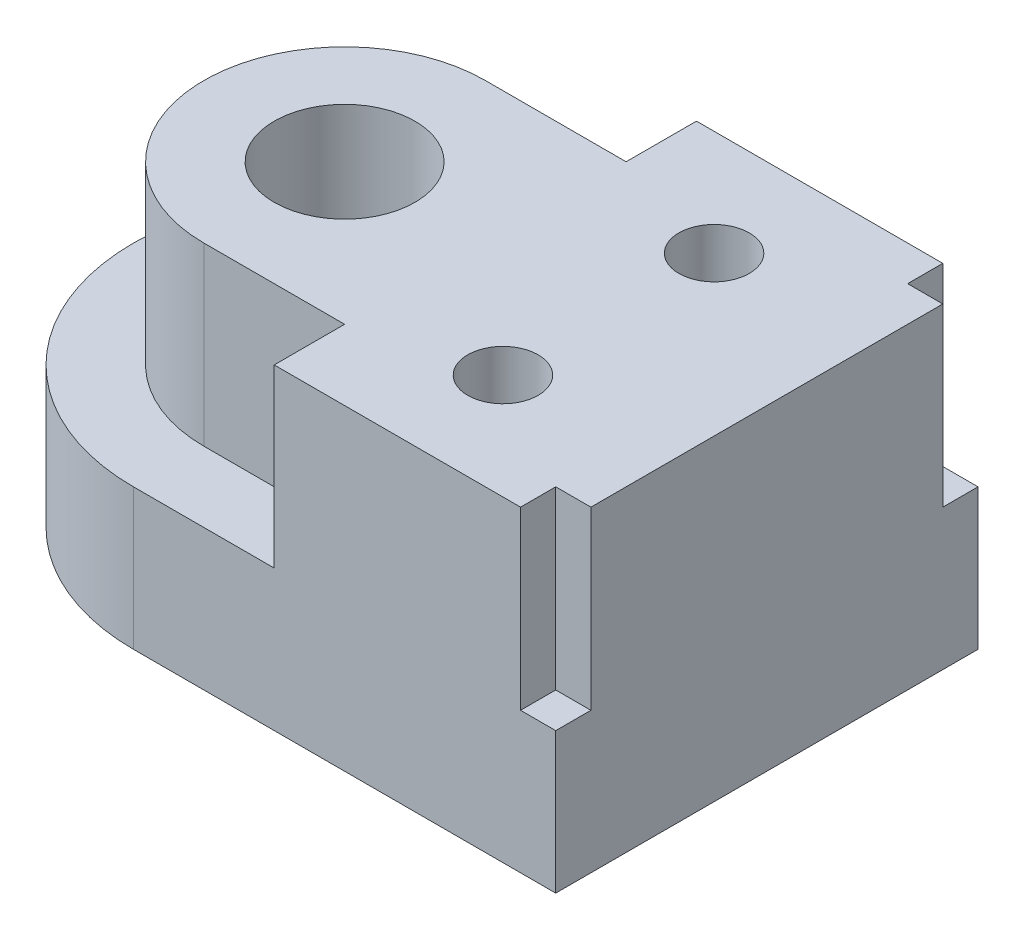
ISO-10303-21;
HEADER;
FILE_DESCRIPTION(('STEP AP214'),'2;1');
FILE_NAME('part.step','',(''),(''),'','','');
FILE_SCHEMA(('AUTOMOTIVE_DESIGN { 1 0 10303 214 1 1 1 1 }'));
ENDSEC;
DATA;
#1=APPLICATION_CONTEXT('core data for automotive mechanical design processes');
#2=APPLICATION_PROTOCOL_DEFINITION('international standard','automotive_design',2000,#1);
#3=PRODUCT_CONTEXT('',#1,'mechanical');
#4=PRODUCT('Part','Part','',(#3));
#5=PRODUCT_RELATED_PRODUCT_CATEGORY('part','',(#4));
#6=PRODUCT_DEFINITION_FORMATION('','',#4);
#7=PRODUCT_DEFINITION_CONTEXT('part definition',#1,'design');
#8=PRODUCT_DEFINITION('design','',#6,#7);
#9=PRODUCT_DEFINITION_SHAPE('','',#8);
#10=(LENGTH_UNIT() NAMED_UNIT(*) SI_UNIT(.MILLI.,.METRE.));
#11=(NAMED_UNIT(*) PLANE_ANGLE_UNIT() SI_UNIT($,.RADIAN.));
#12=(NAMED_UNIT(*) SI_UNIT($,.STERADIAN.) SOLID_ANGLE_UNIT());
#13=UNCERTAINTY_MEASURE_WITH_UNIT(LENGTH_MEASURE(1.E-05),#10,'distance_accuracy_value','');
#14=(GEOMETRIC_REPRESENTATION_CONTEXT(3) GLOBAL_UNCERTAINTY_ASSIGNED_CONTEXT((#13)) GLOBAL_UNIT_ASSIGNED_CONTEXT((#10,
#11,#12)) REPRESENTATION_CONTEXT('',''));
#15=CARTESIAN_POINT('',(0.,0.,0.));
#16=DIRECTION('',(0.,0.,1.));
#17=DIRECTION('',(1.,0.,0.));
#18=AXIS2_PLACEMENT_3D('',#15,#16,#17);
#19=CARTESIAN_POINT('',(0.,45.,-20.));
#20=DIRECTION('',(0.,0.,-1.));
#21=DIRECTION('',(-1.,0.,0.));
#22=AXIS2_PLACEMENT_3D('',#19,#20,#21);
#23=PLANE('',#22);
#24=DIRECTION('',(1.,0.,0.));
#25=VECTOR('',#24,1.);
#26=CARTESIAN_POINT('',(0.,20.,-20.));
#27=LINE('',#26,#25);
#28=CARTESIAN_POINT('',(0.,20.,-20.));
#29=VERTEX_POINT('',#28);
#30=CARTESIAN_POINT('',(20.,20.,-20.));
#31=VERTEX_POINT('',#30);
#32=EDGE_CURVE('E253',#29,#31,#27,.T.);
#33=ORIENTED_EDGE('',*,*,#32,.F.);
#34=DIRECTION('',(0.,-1.,0.));
#35=VECTOR('',#34,1.);
#36=CARTESIAN_POINT('',(0.,45.,-20.));
#37=LINE('',#36,#35);
#38=CARTESIAN_POINT('',(0.,45.,-20.));
#39=VERTEX_POINT('',#38);
#40=EDGE_CURVE('E11',#39,#29,#37,.T.);
#41=ORIENTED_EDGE('',*,*,#40,.F.);
#42=DIRECTION('',(1.,0.,0.));
#43=VECTOR('',#42,1.);
#44=CARTESIAN_POINT('',(0.,45.,-20.));
#45=LINE('',#44,#43);
#46=CARTESIAN_POINT('',(20.,45.,-20.));
#47=VERTEX_POINT('',#46);
#48=EDGE_CURVE('E216',#39,#47,#45,.T.);
#49=ORIENTED_EDGE('',*,*,#48,.T.);
#50=DIRECTION('',(0.,-1.,0.));
#51=VECTOR('',#50,1.);
#52=CARTESIAN_POINT('',(20.,45.,-20.));
#53=LINE('',#52,#51);
#54=EDGE_CURVE('E236',#47,#31,#53,.T.);
#55=ORIENTED_EDGE('',*,*,#54,.T.);
#56=EDGE_LOOP('',(#33,#41,#49,#55));
#57=FACE_BOUND('',#56,.T.);
#58=ADVANCED_FACE('F33',(#57),#23,.T.);
#59=CARTESIAN_POINT('',(0.,45.,0.));
#60=DIRECTION('',(0.,-1.,0.));
#61=DIRECTION('',(0.,0.,-1.));
#62=AXIS2_PLACEMENT_3D('',#59,#60,#61);
#63=CYLINDRICAL_SURFACE('',#62,20.);
#64=ORIENTED_EDGE('',*,*,#40,.T.);
#65=CARTESIAN_POINT('',(0.,20.,0.));
#66=DIRECTION('',(0.,1.,0.));
#67=DIRECTION('',(0.,0.,1.));
#68=AXIS2_PLACEMENT_3D('',#65,#66,#67);
#69=CIRCLE('',#68,20.);
#70=CARTESIAN_POINT('',(0.,20.,20.));
#71=VERTEX_POINT('',#70);
#72=EDGE_CURVE('E199',#29,#71,#69,.T.);
#73=ORIENTED_EDGE('',*,*,#72,.T.);
#74=DIRECTION('',(0.,-1.,0.));
#75=VECTOR('',#74,1.);
#76=CARTESIAN_POINT('',(0.,45.,20.));
#77=LINE('',#76,#75);
#78=CARTESIAN_POINT('',(0.,45.,20.));
#79=VERTEX_POINT('',#78);
#80=EDGE_CURVE('E40',#79,#71,#77,.T.);
#81=ORIENTED_EDGE('',*,*,#80,.F.);
#82=CARTESIAN_POINT('',(0.,45.,0.));
#83=DIRECTION('',(0.,1.,0.));
#84=DIRECTION('',(0.,0.,1.));
#85=AXIS2_PLACEMENT_3D('',#82,#83,#84);
#86=CIRCLE('',#85,20.);
#87=EDGE_CURVE('E219',#39,#79,#86,.T.);
#88=ORIENTED_EDGE('',*,*,#87,.F.);
#89=EDGE_LOOP('',(#64,#73,#81,#88));
#90=FACE_BOUND('',#89,.T.);
#91=ADVANCED_FACE('F299',(#90),#63,.T.);
#92=CARTESIAN_POINT('',(0.,45.,20.));
#93=DIRECTION('',(0.,0.,-1.));
#94=DIRECTION('',(-1.,0.,0.));
#95=AXIS2_PLACEMENT_3D('',#92,#93,#94);
#96=PLANE('',#95);
#97=ORIENTED_EDGE('',*,*,#80,.T.);
#98=DIRECTION('',(1.,0.,0.));
#99=VECTOR('',#98,1.);
#100=CARTESIAN_POINT('',(0.,20.,20.));
#101=LINE('',#100,#99);
#102=CARTESIAN_POINT('',(20.,20.,20.));
#103=VERTEX_POINT('',#102);
#104=EDGE_CURVE('E190',#71,#103,#101,.T.);
#105=ORIENTED_EDGE('',*,*,#104,.T.);
#106=DIRECTION('',(0.,-1.,0.));
#107=VECTOR('',#106,1.);
#108=CARTESIAN_POINT('',(20.,45.,20.));
#109=LINE('',#108,#107);
#110=CARTESIAN_POINT('',(20.,45.,20.));
#111=VERTEX_POINT('',#110);
#112=EDGE_CURVE('E176',#111,#103,#109,.T.);
#113=ORIENTED_EDGE('',*,*,#112,.F.);
#114=DIRECTION('',(1.,0.,0.));
#115=VECTOR('',#114,1.);
#116=CARTESIAN_POINT('',(0.,45.,20.));
#117=LINE('',#116,#115);
#118=EDGE_CURVE('E191',#79,#111,#117,.T.);
#119=ORIENTED_EDGE('',*,*,#118,.F.);
#120=EDGE_LOOP('',(#97,#105,#113,#119));
#121=FACE_BOUND('',#120,.T.);
#122=ADVANCED_FACE('F188',(#121),#96,.F.);
#123=CARTESIAN_POINT('',(20.,45.,0.));
#124=DIRECTION('',(1.,0.,0.));
#125=DIRECTION('',(0.,0.,-1.));
#126=AXIS2_PLACEMENT_3D('',#123,#124,#125);
#127=PLANE('',#126);
#128=ORIENTED_EDGE('',*,*,#112,.T.);
#129=DIRECTION('',(0.,0.,1.));
#130=VECTOR('',#129,1.);
#131=CARTESIAN_POINT('',(20.,20.,0.));
#132=LINE('',#131,#130);
#133=CARTESIAN_POINT('',(20.,20.,30.));
#134=VERTEX_POINT('',#133);
#135=EDGE_CURVE('E201',#103,#134,#132,.T.);
#136=ORIENTED_EDGE('',*,*,#135,.T.);
#137=DIRECTION('',(0.,-1.,0.));
#138=VECTOR('',#137,1.);
#139=CARTESIAN_POINT('',(20.,45.,30.));
#140=LINE('',#139,#138);
#141=CARTESIAN_POINT('',(20.,45.,30.));
#142=VERTEX_POINT('',#141);
#143=EDGE_CURVE('E172',#142,#134,#140,.T.);
#144=ORIENTED_EDGE('',*,*,#143,.F.);
#145=DIRECTION('',(0.,0.,1.));
#146=VECTOR('',#145,1.);
#147=CARTESIAN_POINT('',(20.,45.,0.));
#148=LINE('',#147,#146);
#149=EDGE_CURVE('E223',#111,#142,#148,.T.);
#150=ORIENTED_EDGE('',*,*,#149,.F.);
#151=EDGE_LOOP('',(#128,#136,#144,#150));
#152=FACE_BOUND('',#151,.T.);
#153=ADVANCED_FACE('F332',(#152),#127,.F.);
#154=CARTESIAN_POINT('',(0.,45.,30.));
#155=DIRECTION('',(0.,0.,1.));
#156=DIRECTION('',(1.,0.,0.));
#157=AXIS2_PLACEMENT_3D('',#154,#155,#156);
#158=PLANE('',#157);
#159=DIRECTION('',(0.,1.,0.));
#160=VECTOR('',#159,1.);
#161=CARTESIAN_POINT('',(55.,20.,30.));
#162=LINE('',#161,#160);
#163=CARTESIAN_POINT('',(55.,20.,30.));
#164=VERTEX_POINT('',#163);
#165=CARTESIAN_POINT('',(55.,45.,30.));
#166=VERTEX_POINT('',#165);
#167=EDGE_CURVE('E212',#164,#166,#162,.T.);
#168=ORIENTED_EDGE('',*,*,#167,.T.);
#169=DIRECTION('',(-1.,0.,0.));
#170=VECTOR('',#169,1.);
#171=CARTESIAN_POINT('',(0.,45.,30.));
#172=LINE('',#171,#170);
#173=EDGE_CURVE('E226',#166,#142,#172,.T.);
#174=ORIENTED_EDGE('',*,*,#173,.T.);
#175=ORIENTED_EDGE('',*,*,#143,.T.);
#176=DIRECTION('',(-1.,0.,0.));
#177=VECTOR('',#176,1.);
#178=CARTESIAN_POINT('',(0.,20.,30.));
#179=LINE('',#178,#177);
#180=CARTESIAN_POINT('',(0.,20.,30.));
#181=VERTEX_POINT('',#180);
#182=EDGE_CURVE('E206',#134,#181,#179,.T.);
#183=ORIENTED_EDGE('',*,*,#182,.T.);
#184=DIRECTION('',(0.,-1.,0.));
#185=VECTOR('',#184,1.);
#186=CARTESIAN_POINT('',(0.,20.,30.));
#187=LINE('',#186,#185);
#188=CARTESIAN_POINT('',(0.,0.,30.));
#189=VERTEX_POINT('',#188);
#190=EDGE_CURVE('E202',#181,#189,#187,.T.);
#191=ORIENTED_EDGE('',*,*,#190,.T.);
#192=DIRECTION('',(-1.,0.,0.));
#193=VECTOR('',#192,1.);
#194=CARTESIAN_POINT('',(0.,0.,30.));
#195=LINE('',#194,#193);
#196=CARTESIAN_POINT('',(60.,0.,30.));
#197=VERTEX_POINT('',#196);
#198=EDGE_CURVE('E170',#197,#189,#195,.T.);
#199=ORIENTED_EDGE('',*,*,#198,.F.);
#200=DIRECTION('',(0.,-1.,0.));
#201=VECTOR('',#200,1.);
#202=CARTESIAN_POINT('',(60.,45.,30.));
#203=LINE('',#202,#201);
#204=CARTESIAN_POINT('',(60.,20.,30.));
#205=VERTEX_POINT('',#204);
#206=EDGE_CURVE('E163',#205,#197,#203,.T.);
#207=ORIENTED_EDGE('',*,*,#206,.F.);
#208=DIRECTION('',(1.,0.,0.));
#209=VECTOR('',#208,1.);
#210=CARTESIAN_POINT('',(55.,20.,30.));
#211=LINE('',#210,#209);
#212=EDGE_CURVE('E148',#164,#205,#211,.T.);
#213=ORIENTED_EDGE('',*,*,#212,.F.);
#214=EDGE_LOOP('',(#168,#174,#175,#183,#191,#199,#207,#213));
#215=FACE_BOUND('',#214,.T.);
#216=ADVANCED_FACE('F168',(#215),#158,.T.);
#217=CARTESIAN_POINT('',(60.,45.,0.));
#218=DIRECTION('',(1.,0.,0.));
#219=DIRECTION('',(0.,0.,-1.));
#220=AXIS2_PLACEMENT_3D('',#217,#218,#219);
#221=PLANE('',#220);
#222=DIRECTION('',(0.,1.,0.));
#223=VECTOR('',#222,1.);
#224=CARTESIAN_POINT('',(60.,20.,25.));
#225=LINE('',#224,#223);
#226=CARTESIAN_POINT('',(60.,20.,25.));
#227=VERTEX_POINT('',#226);
#228=CARTESIAN_POINT('',(60.,45.,25.));
#229=VERTEX_POINT('',#228);
#230=EDGE_CURVE('E55',#227,#229,#225,.T.);
#231=ORIENTED_EDGE('',*,*,#230,.F.);
#232=DIRECTION('',(0.,0.,-1.));
#233=VECTOR('',#232,1.);
#234=CARTESIAN_POINT('',(60.,20.,30.));
#235=LINE('',#234,#233);
#236=EDGE_CURVE('E152',#205,#227,#235,.T.);
#237=ORIENTED_EDGE('',*,*,#236,.F.);
#238=ORIENTED_EDGE('',*,*,#206,.T.);
#239=DIRECTION('',(0.,0.,1.));
#240=VECTOR('',#239,1.);
#241=CARTESIAN_POINT('',(60.,0.,0.));
#242=LINE('',#241,#240);
#243=CARTESIAN_POINT('',(60.,0.,-30.));
#244=VERTEX_POINT('',#243);
#245=EDGE_CURVE('E238',#244,#197,#242,.T.);
#246=ORIENTED_EDGE('',*,*,#245,.F.);
#247=DIRECTION('',(0.,-1.,0.));
#248=VECTOR('',#247,1.);
#249=CARTESIAN_POINT('',(60.,45.,-30.));
#250=LINE('',#249,#248);
#251=CARTESIAN_POINT('',(60.,20.,-30.));
#252=VERTEX_POINT('',#251);
#253=EDGE_CURVE('E173',#252,#244,#250,.T.);
#254=ORIENTED_EDGE('',*,*,#253,.F.);
#255=DIRECTION('',(0.,0.,-1.));
#256=VECTOR('',#255,1.);
#257=CARTESIAN_POINT('',(60.,20.,-25.));
#258=LINE('',#257,#256);
#259=CARTESIAN_POINT('',(60.,20.,-25.));
#260=VERTEX_POINT('',#259);
#261=EDGE_CURVE('E272',#260,#252,#258,.T.);
#262=ORIENTED_EDGE('',*,*,#261,.F.);
#263=DIRECTION('',(0.,1.,0.));
#264=VECTOR('',#263,1.);
#265=CARTESIAN_POINT('',(60.,20.,-25.));
#266=LINE('',#265,#264);
#267=CARTESIAN_POINT('',(60.,45.,-25.));
#268=VERTEX_POINT('',#267);
#269=EDGE_CURVE('E293',#260,#268,#266,.T.);
#270=ORIENTED_EDGE('',*,*,#269,.T.);
#271=DIRECTION('',(0.,0.,1.));
#272=VECTOR('',#271,1.);
#273=CARTESIAN_POINT('',(60.,45.,0.));
#274=LINE('',#273,#272);
#275=EDGE_CURVE('E228',#268,#229,#274,.T.);
#276=ORIENTED_EDGE('',*,*,#275,.T.);
#277=EDGE_LOOP('',(#231,#237,#238,#246,#254,#262,#270,#276));
#278=FACE_BOUND('',#277,.T.);
#279=ADVANCED_FACE('F161',(#278),#221,.T.);
#280=CARTESIAN_POINT('',(0.,45.,-30.));
#281=DIRECTION('',(0.,0.,-1.));
#282=DIRECTION('',(-1.,0.,0.));
#283=AXIS2_PLACEMENT_3D('',#280,#281,#282);
#284=PLANE('',#283);
#285=DIRECTION('',(0.,1.,0.));
#286=VECTOR('',#285,1.);
#287=CARTESIAN_POINT('',(55.,20.,-30.));
#288=LINE('',#287,#286);
#289=CARTESIAN_POINT('',(55.,20.,-30.));
#290=VERTEX_POINT('',#289);
#291=CARTESIAN_POINT('',(55.,45.,-30.));
#292=VERTEX_POINT('',#291);
#293=EDGE_CURVE('E47',#290,#292,#288,.T.);
#294=ORIENTED_EDGE('',*,*,#293,.F.);
#295=DIRECTION('',(-1.,0.,0.));
#296=VECTOR('',#295,1.);
#297=CARTESIAN_POINT('',(60.,20.,-30.));
#298=LINE('',#297,#296);
#299=EDGE_CURVE('E275',#252,#290,#298,.T.);
#300=ORIENTED_EDGE('',*,*,#299,.F.);
#301=ORIENTED_EDGE('',*,*,#253,.T.);
#302=DIRECTION('',(1.,0.,0.));
#303=VECTOR('',#302,1.);
#304=CARTESIAN_POINT('',(0.,0.,-30.));
#305=LINE('',#304,#303);
#306=CARTESIAN_POINT('',(0.,0.,-30.));
#307=VERTEX_POINT('',#306);
#308=EDGE_CURVE('E220',#307,#244,#305,.T.);
#309=ORIENTED_EDGE('',*,*,#308,.F.);
#310=DIRECTION('',(0.,-1.,0.));
#311=VECTOR('',#310,1.);
#312=CARTESIAN_POINT('',(0.,20.,-30.));
#313=LINE('',#312,#311);
#314=CARTESIAN_POINT('',(0.,20.,-30.));
#315=VERTEX_POINT('',#314);
#316=EDGE_CURVE('E204',#315,#307,#313,.T.);
#317=ORIENTED_EDGE('',*,*,#316,.F.);
#318=DIRECTION('',(1.,0.,0.));
#319=VECTOR('',#318,1.);
#320=CARTESIAN_POINT('',(0.,20.,-30.));
#321=LINE('',#320,#319);
#322=CARTESIAN_POINT('',(20.,20.,-30.));
#323=VERTEX_POINT('',#322);
#324=EDGE_CURVE('E252',#315,#323,#321,.T.);
#325=ORIENTED_EDGE('',*,*,#324,.T.);
#326=DIRECTION('',(0.,-1.,0.));
#327=VECTOR('',#326,1.);
#328=CARTESIAN_POINT('',(20.,45.,-30.));
#329=LINE('',#328,#327);
#330=CARTESIAN_POINT('',(20.,45.,-30.));
#331=VERTEX_POINT('',#330);
#332=EDGE_CURVE('E178',#331,#323,#329,.T.);
#333=ORIENTED_EDGE('',*,*,#332,.F.);
#334=DIRECTION('',(1.,0.,0.));
#335=VECTOR('',#334,1.);
#336=CARTESIAN_POINT('',(0.,45.,-30.));
#337=LINE('',#336,#335);
#338=EDGE_CURVE('E230',#331,#292,#337,.T.);
#339=ORIENTED_EDGE('',*,*,#338,.T.);
#340=EDGE_LOOP('',(#294,#300,#301,#309,#317,#325,#333,#339));
#341=FACE_BOUND('',#340,.T.);
#342=ADVANCED_FACE('F255',(#341),#284,.T.);
#343=CARTESIAN_POINT('',(20.,45.,0.));
#344=DIRECTION('',(-1.,0.,0.));
#345=DIRECTION('',(0.,0.,1.));
#346=AXIS2_PLACEMENT_3D('',#343,#344,#345);
#347=PLANE('',#346);
#348=DIRECTION('',(0.,0.,-1.));
#349=VECTOR('',#348,1.);
#350=CARTESIAN_POINT('',(20.,20.,0.));
#351=LINE('',#350,#349);
#352=EDGE_CURVE('E246',#31,#323,#351,.T.);
#353=ORIENTED_EDGE('',*,*,#352,.F.);
#354=ORIENTED_EDGE('',*,*,#54,.F.);
#355=DIRECTION('',(0.,0.,-1.));
#356=VECTOR('',#355,1.);
#357=CARTESIAN_POINT('',(20.,45.,0.));
#358=LINE('',#357,#356);
#359=EDGE_CURVE('E233',#47,#331,#358,.T.);
#360=ORIENTED_EDGE('',*,*,#359,.T.);
#361=ORIENTED_EDGE('',*,*,#332,.T.);
#362=EDGE_LOOP('',(#353,#354,#360,#361));
#363=FACE_BOUND('',#362,.T.);
#364=ADVANCED_FACE('F245',(#363),#347,.T.);
#365=CARTESIAN_POINT('',(0.,45.,0.));
#366=DIRECTION('',(0.,1.,0.));
#367=DIRECTION('',(0.,0.,1.));
#368=AXIS2_PLACEMENT_3D('',#365,#366,#367);
#369=PLANE('',#368);
#370=CARTESIAN_POINT('',(0.,45.,0.));
#371=DIRECTION('',(0.,1.,0.));
#372=DIRECTION('',(0.,0.,1.));
#373=AXIS2_PLACEMENT_3D('',#370,#371,#372);
#374=CIRCLE('',#373,10.);
#375=CARTESIAN_POINT('',(0.,45.,10.));
#376=VERTEX_POINT('',#375);
#377=EDGE_CURVE('E446',#376,#376,#374,.T.);
#378=ORIENTED_EDGE('',*,*,#377,.F.);
#379=EDGE_LOOP('',(#378));
#380=FACE_BOUND('',#379,.T.);
#381=CARTESIAN_POINT('',(37.5,45.,-15.));
#382=DIRECTION('',(0.,1.,0.));
#383=DIRECTION('',(0.,0.,1.));
#384=AXIS2_PLACEMENT_3D('',#381,#382,#383);
#385=CIRCLE('',#384,5.);
#386=CARTESIAN_POINT('',(37.5,45.,-10.));
#387=VERTEX_POINT('',#386);
#388=EDGE_CURVE('E451',#387,#387,#385,.T.);
#389=ORIENTED_EDGE('',*,*,#388,.F.);
#390=EDGE_LOOP('',(#389));
#391=FACE_BOUND('',#390,.T.);
#392=CARTESIAN_POINT('',(37.5,45.,15.));
#393=DIRECTION('',(0.,1.,0.));
#394=DIRECTION('',(0.,0.,1.));
#395=AXIS2_PLACEMENT_3D('',#392,#393,#394);
#396=CIRCLE('',#395,5.);
#397=CARTESIAN_POINT('',(37.5,45.,20.));
#398=VERTEX_POINT('',#397);
#399=EDGE_CURVE('E459',#398,#398,#396,.T.);
#400=ORIENTED_EDGE('',*,*,#399,.F.);
#401=EDGE_LOOP('',(#400));
#402=FACE_BOUND('',#401,.T.);
#403=DIRECTION('',(0.,0.,1.));
#404=VECTOR('',#403,1.);
#405=CARTESIAN_POINT('',(55.,45.,30.));
#406=LINE('',#405,#404);
#407=CARTESIAN_POINT('',(55.,45.,25.));
#408=VERTEX_POINT('',#407);
#409=EDGE_CURVE('E158',#408,#166,#406,.T.);
#410=ORIENTED_EDGE('',*,*,#409,.F.);
#411=DIRECTION('',(-1.,0.,0.));
#412=VECTOR('',#411,1.);
#413=CARTESIAN_POINT('',(55.,45.,25.));
#414=LINE('',#413,#412);
#415=EDGE_CURVE('E295',#229,#408,#414,.T.);
#416=ORIENTED_EDGE('',*,*,#415,.F.);
#417=ORIENTED_EDGE('',*,*,#275,.F.);
#418=DIRECTION('',(1.,0.,0.));
#419=VECTOR('',#418,1.);
#420=CARTESIAN_POINT('',(55.,45.,-25.));
#421=LINE('',#420,#419);
#422=CARTESIAN_POINT('',(55.,45.,-25.));
#423=VERTEX_POINT('',#422);
#424=EDGE_CURVE('E279',#423,#268,#421,.T.);
#425=ORIENTED_EDGE('',*,*,#424,.F.);
#426=DIRECTION('',(0.,0.,1.));
#427=VECTOR('',#426,1.);
#428=CARTESIAN_POINT('',(55.,45.,-30.));
#429=LINE('',#428,#427);
#430=EDGE_CURVE('E283',#292,#423,#429,.T.);
#431=ORIENTED_EDGE('',*,*,#430,.F.);
#432=ORIENTED_EDGE('',*,*,#338,.F.);
#433=ORIENTED_EDGE('',*,*,#359,.F.);
#434=ORIENTED_EDGE('',*,*,#48,.F.);
#435=ORIENTED_EDGE('',*,*,#87,.T.);
#436=ORIENTED_EDGE('',*,*,#118,.T.);
#437=ORIENTED_EDGE('',*,*,#149,.T.);
#438=ORIENTED_EDGE('',*,*,#173,.F.);
#439=EDGE_LOOP('',(#410,#416,#417,#425,#431,#432,#433,#434,#435,#436,#437,#438));
#440=FACE_BOUND('',#439,.T.);
#441=ADVANCED_FACE('F304',(#380,#391,#402,#440),#369,.T.);
#442=CARTESIAN_POINT('',(0.,0.,0.));
#443=DIRECTION('',(0.,1.,0.));
#444=DIRECTION('',(0.,0.,1.));
#445=AXIS2_PLACEMENT_3D('',#442,#443,#444);
#446=PLANE('',#445);
#447=CARTESIAN_POINT('',(0.,0.,0.));
#448=DIRECTION('',(0.,1.,0.));
#449=DIRECTION('',(0.,0.,1.));
#450=AXIS2_PLACEMENT_3D('',#447,#448,#449);
#451=CIRCLE('',#450,10.);
#452=CARTESIAN_POINT('',(0.,0.,10.));
#453=VERTEX_POINT('',#452);
#454=EDGE_CURVE('E291',#453,#453,#451,.T.);
#455=ORIENTED_EDGE('',*,*,#454,.T.);
#456=EDGE_LOOP('',(#455));
#457=FACE_BOUND('',#456,.T.);
#458=CARTESIAN_POINT('',(37.5,0.,-15.));
#459=DIRECTION('',(0.,1.,0.));
#460=DIRECTION('',(0.,0.,1.));
#461=AXIS2_PLACEMENT_3D('',#458,#459,#460);
#462=CIRCLE('',#461,5.);
#463=CARTESIAN_POINT('',(37.5,0.,-10.));
#464=VERTEX_POINT('',#463);
#465=EDGE_CURVE('E447',#464,#464,#462,.T.);
#466=ORIENTED_EDGE('',*,*,#465,.T.);
#467=EDGE_LOOP('',(#466));
#468=FACE_BOUND('',#467,.T.);
#469=CARTESIAN_POINT('',(37.5,0.,15.));
#470=DIRECTION('',(0.,1.,0.));
#471=DIRECTION('',(0.,0.,1.));
#472=AXIS2_PLACEMENT_3D('',#469,#470,#471);
#473=CIRCLE('',#472,5.);
#474=CARTESIAN_POINT('',(37.5,0.,20.));
#475=VERTEX_POINT('',#474);
#476=EDGE_CURVE('E456',#475,#475,#473,.T.);
#477=ORIENTED_EDGE('',*,*,#476,.T.);
#478=EDGE_LOOP('',(#477));
#479=FACE_BOUND('',#478,.T.);
#480=CARTESIAN_POINT('',(0.,0.,0.));
#481=DIRECTION('',(0.,1.,0.));
#482=DIRECTION('',(0.,0.,1.));
#483=AXIS2_PLACEMENT_3D('',#480,#481,#482);
#484=CIRCLE('',#483,30.);
#485=EDGE_CURVE('E210',#307,#189,#484,.T.);
#486=ORIENTED_EDGE('',*,*,#485,.F.);
#487=ORIENTED_EDGE('',*,*,#308,.T.);
#488=ORIENTED_EDGE('',*,*,#245,.T.);
#489=ORIENTED_EDGE('',*,*,#198,.T.);
#490=EDGE_LOOP('',(#486,#487,#488,#489));
#491=FACE_BOUND('',#490,.T.);
#492=ADVANCED_FACE('F268',(#457,#468,#479,#491),#446,.F.);
#493=CARTESIAN_POINT('',(0.,20.,0.));
#494=DIRECTION('',(0.,-1.,0.));
#495=DIRECTION('',(0.,0.,-1.));
#496=AXIS2_PLACEMENT_3D('',#493,#494,#495);
#497=CYLINDRICAL_SURFACE('',#496,30.);
#498=ORIENTED_EDGE('',*,*,#485,.T.);
#499=ORIENTED_EDGE('',*,*,#190,.F.);
#500=CARTESIAN_POINT('',(0.,20.,0.));
#501=DIRECTION('',(0.,1.,0.));
#502=DIRECTION('',(0.,0.,1.));
#503=AXIS2_PLACEMENT_3D('',#500,#501,#502);
#504=CIRCLE('',#503,30.);
#505=EDGE_CURVE('E257',#315,#181,#504,.T.);
#506=ORIENTED_EDGE('',*,*,#505,.F.);
#507=ORIENTED_EDGE('',*,*,#316,.T.);
#508=EDGE_LOOP('',(#498,#499,#506,#507));
#509=FACE_BOUND('',#508,.T.);
#510=ADVANCED_FACE('F265',(#509),#497,.T.);
#511=CARTESIAN_POINT('',(0.,20.,0.));
#512=DIRECTION('',(0.,1.,0.));
#513=DIRECTION('',(0.,0.,1.));
#514=AXIS2_PLACEMENT_3D('',#511,#512,#513);
#515=PLANE('',#514);
#516=ORIENTED_EDGE('',*,*,#72,.F.);
#517=ORIENTED_EDGE('',*,*,#32,.T.);
#518=ORIENTED_EDGE('',*,*,#352,.T.);
#519=ORIENTED_EDGE('',*,*,#324,.F.);
#520=ORIENTED_EDGE('',*,*,#505,.T.);
#521=ORIENTED_EDGE('',*,*,#182,.F.);
#522=ORIENTED_EDGE('',*,*,#135,.F.);
#523=ORIENTED_EDGE('',*,*,#104,.F.);
#524=EDGE_LOOP('',(#516,#517,#518,#519,#520,#521,#522,#523));
#525=FACE_BOUND('',#524,.T.);
#526=ADVANCED_FACE('F197',(#525),#515,.T.);
#527=CARTESIAN_POINT('',(55.,20.,-25.));
#528=DIRECTION('',(0.,0.,1.));
#529=DIRECTION('',(1.,0.,0.));
#530=AXIS2_PLACEMENT_3D('',#527,#528,#529);
#531=PLANE('',#530);
#532=ORIENTED_EDGE('',*,*,#424,.T.);
#533=ORIENTED_EDGE('',*,*,#269,.F.);
#534=DIRECTION('',(1.,0.,0.));
#535=VECTOR('',#534,1.);
#536=CARTESIAN_POINT('',(55.,20.,-25.));
#537=LINE('',#536,#535);
#538=CARTESIAN_POINT('',(55.,20.,-25.));
#539=VERTEX_POINT('',#538);
#540=EDGE_CURVE('E281',#539,#260,#537,.T.);
#541=ORIENTED_EDGE('',*,*,#540,.F.);
#542=DIRECTION('',(0.,1.,0.));
#543=VECTOR('',#542,1.);
#544=CARTESIAN_POINT('',(55.,20.,-25.));
#545=LINE('',#544,#543);
#546=EDGE_CURVE('E296',#539,#423,#545,.T.);
#547=ORIENTED_EDGE('',*,*,#546,.T.);
#548=EDGE_LOOP('',(#532,#533,#541,#547));
#549=FACE_BOUND('',#548,.T.);
#550=ADVANCED_FACE('F310',(#549),#531,.F.);
#551=CARTESIAN_POINT('',(55.,20.,-30.));
#552=DIRECTION('',(-1.,0.,0.));
#553=DIRECTION('',(0.,0.,1.));
#554=AXIS2_PLACEMENT_3D('',#551,#552,#553);
#555=PLANE('',#554);
#556=ORIENTED_EDGE('',*,*,#430,.T.);
#557=ORIENTED_EDGE('',*,*,#546,.F.);
#558=DIRECTION('',(0.,0.,1.));
#559=VECTOR('',#558,1.);
#560=CARTESIAN_POINT('',(55.,20.,-30.));
#561=LINE('',#560,#559);
#562=EDGE_CURVE('E278',#290,#539,#561,.T.);
#563=ORIENTED_EDGE('',*,*,#562,.F.);
#564=ORIENTED_EDGE('',*,*,#293,.T.);
#565=EDGE_LOOP('',(#556,#557,#563,#564));
#566=FACE_BOUND('',#565,.T.);
#567=ADVANCED_FACE('F307',(#566),#555,.F.);
#568=CARTESIAN_POINT('',(0.,20.,0.));
#569=DIRECTION('',(0.,1.,0.));
#570=DIRECTION('',(0.,0.,1.));
#571=AXIS2_PLACEMENT_3D('',#568,#569,#570);
#572=PLANE('',#571);
#573=ORIENTED_EDGE('',*,*,#299,.T.);
#574=ORIENTED_EDGE('',*,*,#562,.T.);
#575=ORIENTED_EDGE('',*,*,#540,.T.);
#576=ORIENTED_EDGE('',*,*,#261,.T.);
#577=EDGE_LOOP('',(#573,#574,#575,#576));
#578=FACE_BOUND('',#577,.T.);
#579=ADVANCED_FACE('F311',(#578),#572,.T.);
#580=CARTESIAN_POINT('',(55.,20.,30.));
#581=DIRECTION('',(-1.,0.,0.));
#582=DIRECTION('',(0.,0.,1.));
#583=AXIS2_PLACEMENT_3D('',#580,#581,#582);
#584=PLANE('',#583);
#585=ORIENTED_EDGE('',*,*,#409,.T.);
#586=ORIENTED_EDGE('',*,*,#167,.F.);
#587=DIRECTION('',(0.,0.,1.));
#588=VECTOR('',#587,1.);
#589=CARTESIAN_POINT('',(55.,20.,30.));
#590=LINE('',#589,#588);
#591=CARTESIAN_POINT('',(55.,20.,25.));
#592=VERTEX_POINT('',#591);
#593=EDGE_CURVE('E154',#592,#164,#590,.T.);
#594=ORIENTED_EDGE('',*,*,#593,.F.);
#595=DIRECTION('',(0.,1.,0.));
#596=VECTOR('',#595,1.);
#597=CARTESIAN_POINT('',(55.,20.,25.));
#598=LINE('',#597,#596);
#599=EDGE_CURVE('E466',#592,#408,#598,.T.);
#600=ORIENTED_EDGE('',*,*,#599,.T.);
#601=EDGE_LOOP('',(#585,#586,#594,#600));
#602=FACE_BOUND('',#601,.T.);
#603=ADVANCED_FACE('F313',(#602),#584,.F.);
#604=CARTESIAN_POINT('',(55.,20.,25.));
#605=DIRECTION('',(0.,0.,-1.));
#606=DIRECTION('',(-1.,0.,0.));
#607=AXIS2_PLACEMENT_3D('',#604,#605,#606);
#608=PLANE('',#607);
#609=ORIENTED_EDGE('',*,*,#415,.T.);
#610=ORIENTED_EDGE('',*,*,#599,.F.);
#611=DIRECTION('',(-1.,0.,0.));
#612=VECTOR('',#611,1.);
#613=CARTESIAN_POINT('',(55.,20.,25.));
#614=LINE('',#613,#612);
#615=EDGE_CURVE('E166',#227,#592,#614,.T.);
#616=ORIENTED_EDGE('',*,*,#615,.F.);
#617=ORIENTED_EDGE('',*,*,#230,.T.);
#618=EDGE_LOOP('',(#609,#610,#616,#617));
#619=FACE_BOUND('',#618,.T.);
#620=ADVANCED_FACE('F319',(#619),#608,.F.);
#621=CARTESIAN_POINT('',(0.,20.,0.));
#622=DIRECTION('',(0.,1.,0.));
#623=DIRECTION('',(0.,0.,1.));
#624=AXIS2_PLACEMENT_3D('',#621,#622,#623);
#625=PLANE('',#624);
#626=ORIENTED_EDGE('',*,*,#212,.T.);
#627=ORIENTED_EDGE('',*,*,#236,.T.);
#628=ORIENTED_EDGE('',*,*,#615,.T.);
#629=ORIENTED_EDGE('',*,*,#593,.T.);
#630=EDGE_LOOP('',(#626,#627,#628,#629));
#631=FACE_BOUND('',#630,.T.);
#632=ADVANCED_FACE('F150',(#631),#625,.T.);
#633=CARTESIAN_POINT('',(37.5,0.,15.));
#634=DIRECTION('',(0.,1.,0.));
#635=DIRECTION('',(0.,0.,1.));
#636=AXIS2_PLACEMENT_3D('',#633,#634,#635);
#637=CYLINDRICAL_SURFACE('',#636,5.);
#638=CARTESIAN_POINT('',(37.5,0.,20.));
#639=CARTESIAN_POINT('',(37.5,0.468749999999999,20.));
#640=CARTESIAN_POINT('',(37.5,0.9375,20.));
#641=CARTESIAN_POINT('',(37.5,1.875,20.));
#642=CARTESIAN_POINT('',(37.5,2.34375,20.));
#643=CARTESIAN_POINT('',(37.5,3.28125,20.));
#644=CARTESIAN_POINT('',(37.5,3.75,20.));
#645=CARTESIAN_POINT('',(37.5,4.6875,20.));
#646=CARTESIAN_POINT('',(37.5,5.15625,20.));
#647=CARTESIAN_POINT('',(37.5,6.09375,20.));
#648=CARTESIAN_POINT('',(37.5,6.5625,20.));
#649=CARTESIAN_POINT('',(37.5,7.5,20.));
#650=CARTESIAN_POINT('',(37.5,7.96875,20.));
#651=CARTESIAN_POINT('',(37.5,8.90625,20.));
#652=CARTESIAN_POINT('',(37.5,9.375,20.));
#653=CARTESIAN_POINT('',(37.5,10.3125,20.));
#654=CARTESIAN_POINT('',(37.5,10.78125,20.));
#655=CARTESIAN_POINT('',(37.5,11.71875,20.));
#656=CARTESIAN_POINT('',(37.5,12.1875,20.));
#657=CARTESIAN_POINT('',(37.5,13.125,20.));
#658=CARTESIAN_POINT('',(37.5,13.59375,20.));
#659=CARTESIAN_POINT('',(37.5,14.53125,20.));
#660=CARTESIAN_POINT('',(37.5,15.,20.));
#661=CARTESIAN_POINT('',(37.5,15.9375,20.));
#662=CARTESIAN_POINT('',(37.5,16.40625,20.));
#663=CARTESIAN_POINT('',(37.5,17.34375,20.));
#664=CARTESIAN_POINT('',(37.5,17.8125,20.));
#665=CARTESIAN_POINT('',(37.5,18.75,20.));
#666=CARTESIAN_POINT('',(37.5,19.21875,20.));
#667=CARTESIAN_POINT('',(37.5,20.15625,20.));
#668=CARTESIAN_POINT('',(37.5,20.625,20.));
#669=CARTESIAN_POINT('',(37.5,21.5625,20.));
#670=CARTESIAN_POINT('',(37.5,22.03125,20.));
#671=CARTESIAN_POINT('',(37.5,22.96875,20.));
#672=CARTESIAN_POINT('',(37.5,23.4375,20.));
#673=CARTESIAN_POINT('',(37.5,24.375,20.));
#674=CARTESIAN_POINT('',(37.5,24.84375,20.));
#675=CARTESIAN_POINT('',(37.5,25.78125,20.));
#676=CARTESIAN_POINT('',(37.5,26.25,20.));
#677=CARTESIAN_POINT('',(37.5,27.1875,20.));
#678=CARTESIAN_POINT('',(37.5,27.65625,20.));
#679=CARTESIAN_POINT('',(37.5,28.59375,20.));
#680=CARTESIAN_POINT('',(37.5,29.0625,20.));
#681=CARTESIAN_POINT('',(37.5,30.,20.));
#682=CARTESIAN_POINT('',(37.5,30.46875,20.));
#683=CARTESIAN_POINT('',(37.5,31.40625,20.));
#684=CARTESIAN_POINT('',(37.5,31.875,20.));
#685=CARTESIAN_POINT('',(37.5,32.8125,20.));
#686=CARTESIAN_POINT('',(37.5,33.28125,20.));
#687=CARTESIAN_POINT('',(37.5,34.21875,20.));
#688=CARTESIAN_POINT('',(37.5,34.6875,20.));
#689=CARTESIAN_POINT('',(37.5,35.625,20.));
#690=CARTESIAN_POINT('',(37.5,36.09375,20.));
#691=CARTESIAN_POINT('',(37.5,37.03125,20.));
#692=CARTESIAN_POINT('',(37.5,37.5,20.));
#693=CARTESIAN_POINT('',(37.5,38.4375,20.));
#694=CARTESIAN_POINT('',(37.5,38.90625,20.));
#695=CARTESIAN_POINT('',(37.5,39.84375,20.));
#696=CARTESIAN_POINT('',(37.5,40.3125,20.));
#697=CARTESIAN_POINT('',(37.5,41.25,20.));
#698=CARTESIAN_POINT('',(37.5,41.71875,20.));
#699=CARTESIAN_POINT('',(37.5,42.65625,20.));
#700=CARTESIAN_POINT('',(37.5,43.125,20.));
#701=CARTESIAN_POINT('',(37.5,44.0625,20.));
#702=CARTESIAN_POINT('',(37.5,44.53125,20.));
#703=CARTESIAN_POINT('',(37.5,45.,20.));
#704=B_SPLINE_CURVE_WITH_KNOTS('',3,(#638,#639,#640,#641,#642,#643,#644,#645,#646,#647,#648,
#649,#650,#651,#652,#653,#654,#655,#656,#657,#658,#659,#660,#661,#662,#663,#664,#665,#666,#667,
#668,#669,#670,#671,#672,#673,#674,#675,#676,#677,#678,#679,#680,#681,#682,#683,#684,#685,#686,
#687,#688,#689,#690,#691,#692,#693,#694,#695,#696,#697,#698,#699,#700,#701,#702,#703),
.UNSPECIFIED.,.F.,.F.,(4,2,2,2,2,2,2,2,2,2,2,2,2,2,2,2,2,2,2,2,2,2,2,2,2,2,2,2,2,2,2,2,4),(0.,
1.40625,2.8125,4.21875,5.625,7.03125,8.4375,9.84375,11.25,12.65625,14.0625,15.46875,16.875,
18.28125,19.6875,21.09375,22.5,23.90625,25.3125,26.71875,28.125,29.53125,30.9375,32.34375,33.75,
35.15625,36.5625,37.96875,39.375,40.78125,42.1875,43.59375,45.),.UNSPECIFIED.);
#705=EDGE_CURVE('BSEAM391',#475,#398,#704,.T.);
#706=ORIENTED_EDGE('',*,*,#476,.F.);
#707=ORIENTED_EDGE('',*,*,#399,.T.);
#708=ORIENTED_EDGE('',*,*,#705,.T.);
#709=ORIENTED_EDGE('',*,*,#705,.F.);
#710=EDGE_LOOP('',(#706,#708,#707,#709));
#711=FACE_BOUND('',#710,.T.);
#712=ADVANCED_FACE('F391',(#711),#637,.F.);
#713=CARTESIAN_POINT('',(37.5,0.,-15.));
#714=DIRECTION('',(0.,1.,0.));
#715=DIRECTION('',(0.,0.,1.));
#716=AXIS2_PLACEMENT_3D('',#713,#714,#715);
#717=CYLINDRICAL_SURFACE('',#716,5.);
#718=CARTESIAN_POINT('',(37.5,0.,-10.));
#719=CARTESIAN_POINT('',(37.5,0.468749999999999,-10.));
#720=CARTESIAN_POINT('',(37.5,0.9375,-10.));
#721=CARTESIAN_POINT('',(37.5,1.875,-10.));
#722=CARTESIAN_POINT('',(37.5,2.34375,-10.));
#723=CARTESIAN_POINT('',(37.5,3.28125,-10.));
#724=CARTESIAN_POINT('',(37.5,3.75,-10.));
#725=CARTESIAN_POINT('',(37.5,4.6875,-10.));
#726=CARTESIAN_POINT('',(37.5,5.15625,-10.));
#727=CARTESIAN_POINT('',(37.5,6.09375,-10.));
#728=CARTESIAN_POINT('',(37.5,6.5625,-10.));
#729=CARTESIAN_POINT('',(37.5,7.5,-10.));
#730=CARTESIAN_POINT('',(37.5,7.96875,-10.));
#731=CARTESIAN_POINT('',(37.5,8.90625,-10.));
#732=CARTESIAN_POINT('',(37.5,9.375,-10.));
#733=CARTESIAN_POINT('',(37.5,10.3125,-10.));
#734=CARTESIAN_POINT('',(37.5,10.78125,-10.));
#735=CARTESIAN_POINT('',(37.5,11.71875,-10.));
#736=CARTESIAN_POINT('',(37.5,12.1875,-10.));
#737=CARTESIAN_POINT('',(37.5,13.125,-10.));
#738=CARTESIAN_POINT('',(37.5,13.59375,-10.));
#739=CARTESIAN_POINT('',(37.5,14.53125,-10.));
#740=CARTESIAN_POINT('',(37.5,15.,-10.));
#741=CARTESIAN_POINT('',(37.5,15.9375,-10.));
#742=CARTESIAN_POINT('',(37.5,16.40625,-10.));
#743=CARTESIAN_POINT('',(37.5,17.34375,-10.));
#744=CARTESIAN_POINT('',(37.5,17.8125,-10.));
#745=CARTESIAN_POINT('',(37.5,18.75,-10.));
#746=CARTESIAN_POINT('',(37.5,19.21875,-10.));
#747=CARTESIAN_POINT('',(37.5,20.15625,-10.));
#748=CARTESIAN_POINT('',(37.5,20.625,-10.));
#749=CARTESIAN_POINT('',(37.5,21.5625,-10.));
#750=CARTESIAN_POINT('',(37.5,22.03125,-10.));
#751=CARTESIAN_POINT('',(37.5,22.96875,-10.));
#752=CARTESIAN_POINT('',(37.5,23.4375,-10.));
#753=CARTESIAN_POINT('',(37.5,24.375,-10.));
#754=CARTESIAN_POINT('',(37.5,24.84375,-10.));
#755=CARTESIAN_POINT('',(37.5,25.78125,-10.));
#756=CARTESIAN_POINT('',(37.5,26.25,-10.));
#757=CARTESIAN_POINT('',(37.5,27.1875,-10.));
#758=CARTESIAN_POINT('',(37.5,27.65625,-10.));
#759=CARTESIAN_POINT('',(37.5,28.59375,-10.));
#760=CARTESIAN_POINT('',(37.5,29.0625,-10.));
#761=CARTESIAN_POINT('',(37.5,30.,-10.));
#762=CARTESIAN_POINT('',(37.5,30.46875,-10.));
#763=CARTESIAN_POINT('',(37.5,31.40625,-10.));
#764=CARTESIAN_POINT('',(37.5,31.875,-10.));
#765=CARTESIAN_POINT('',(37.5,32.8125,-10.));
#766=CARTESIAN_POINT('',(37.5,33.28125,-10.));
#767=CARTESIAN_POINT('',(37.5,34.21875,-10.));
#768=CARTESIAN_POINT('',(37.5,34.6875,-10.));
#769=CARTESIAN_POINT('',(37.5,35.625,-10.));
#770=CARTESIAN_POINT('',(37.5,36.09375,-10.));
#771=CARTESIAN_POINT('',(37.5,37.03125,-10.));
#772=CARTESIAN_POINT('',(37.5,37.5,-10.));
#773=CARTESIAN_POINT('',(37.5,38.4375,-10.));
#774=CARTESIAN_POINT('',(37.5,38.90625,-10.));
#775=CARTESIAN_POINT('',(37.5,39.84375,-10.));
#776=CARTESIAN_POINT('',(37.5,40.3125,-10.));
#777=CARTESIAN_POINT('',(37.5,41.25,-10.));
#778=CARTESIAN_POINT('',(37.5,41.71875,-10.));
#779=CARTESIAN_POINT('',(37.5,42.65625,-10.));
#780=CARTESIAN_POINT('',(37.5,43.125,-10.));
#781=CARTESIAN_POINT('',(37.5,44.0625,-10.));
#782=CARTESIAN_POINT('',(37.5,44.53125,-10.));
#783=CARTESIAN_POINT('',(37.5,45.,-10.));
#784=B_SPLINE_CURVE_WITH_KNOTS('',3,(#718,#719,#720,#721,#722,#723,#724,#725,#726,#727,#728,
#729,#730,#731,#732,#733,#734,#735,#736,#737,#738,#739,#740,#741,#742,#743,#744,#745,#746,#747,
#748,#749,#750,#751,#752,#753,#754,#755,#756,#757,#758,#759,#760,#761,#762,#763,#764,#765,#766,
#767,#768,#769,#770,#771,#772,#773,#774,#775,#776,#777,#778,#779,#780,#781,#782,#783),
.UNSPECIFIED.,.F.,.F.,(4,2,2,2,2,2,2,2,2,2,2,2,2,2,2,2,2,2,2,2,2,2,2,2,2,2,2,2,2,2,2,2,4),(0.,
1.40625,2.8125,4.21875,5.625,7.03125,8.4375,9.84375,11.25,12.65625,14.0625,15.46875,16.875,
18.28125,19.6875,21.09375,22.5,23.90625,25.3125,26.71875,28.125,29.53125,30.9375,32.34375,33.75,
35.15625,36.5625,37.96875,39.375,40.78125,42.1875,43.59375,45.),.UNSPECIFIED.);
#785=EDGE_CURVE('BSEAM417',#464,#387,#784,.T.);
#786=ORIENTED_EDGE('',*,*,#465,.F.);
#787=ORIENTED_EDGE('',*,*,#388,.T.);
#788=ORIENTED_EDGE('',*,*,#785,.T.);
#789=ORIENTED_EDGE('',*,*,#785,.F.);
#790=EDGE_LOOP('',(#786,#788,#787,#789));
#791=FACE_BOUND('',#790,.T.);
#792=ADVANCED_FACE('F417',(#791),#717,.F.);
#793=CARTESIAN_POINT('',(0.,0.,0.));
#794=DIRECTION('',(0.,1.,0.));
#795=DIRECTION('',(0.,0.,1.));
#796=AXIS2_PLACEMENT_3D('',#793,#794,#795);
#797=CYLINDRICAL_SURFACE('',#796,10.);
#798=CARTESIAN_POINT('',(0.,0.,10.));
#799=CARTESIAN_POINT('',(0.,0.468749999999999,10.));
#800=CARTESIAN_POINT('',(0.,0.9375,10.));
#801=CARTESIAN_POINT('',(0.,1.875,10.));
#802=CARTESIAN_POINT('',(0.,2.34375,10.));
#803=CARTESIAN_POINT('',(0.,3.28125,10.));
#804=CARTESIAN_POINT('',(0.,3.75,10.));
#805=CARTESIAN_POINT('',(0.,4.6875,10.));
#806=CARTESIAN_POINT('',(0.,5.15625,10.));
#807=CARTESIAN_POINT('',(0.,6.09375,10.));
#808=CARTESIAN_POINT('',(0.,6.5625,10.));
#809=CARTESIAN_POINT('',(0.,7.5,10.));
#810=CARTESIAN_POINT('',(0.,7.96875,10.));
#811=CARTESIAN_POINT('',(0.,8.90625,10.));
#812=CARTESIAN_POINT('',(0.,9.375,10.));
#813=CARTESIAN_POINT('',(0.,10.3125,10.));
#814=CARTESIAN_POINT('',(0.,10.78125,10.));
#815=CARTESIAN_POINT('',(0.,11.71875,10.));
#816=CARTESIAN_POINT('',(0.,12.1875,10.));
#817=CARTESIAN_POINT('',(0.,13.125,10.));
#818=CARTESIAN_POINT('',(0.,13.59375,10.));
#819=CARTESIAN_POINT('',(0.,14.53125,10.));
#820=CARTESIAN_POINT('',(0.,15.,10.));
#821=CARTESIAN_POINT('',(0.,15.9375,10.));
#822=CARTESIAN_POINT('',(0.,16.40625,10.));
#823=CARTESIAN_POINT('',(0.,17.34375,10.));
#824=CARTESIAN_POINT('',(0.,17.8125,10.));
#825=CARTESIAN_POINT('',(0.,18.75,10.));
#826=CARTESIAN_POINT('',(0.,19.21875,10.));
#827=CARTESIAN_POINT('',(0.,20.15625,10.));
#828=CARTESIAN_POINT('',(0.,20.625,10.));
#829=CARTESIAN_POINT('',(0.,21.5625,10.));
#830=CARTESIAN_POINT('',(0.,22.03125,10.));
#831=CARTESIAN_POINT('',(0.,22.96875,10.));
#832=CARTESIAN_POINT('',(0.,23.4375,10.));
#833=CARTESIAN_POINT('',(0.,24.375,10.));
#834=CARTESIAN_POINT('',(0.,24.84375,10.));
#835=CARTESIAN_POINT('',(0.,25.78125,10.));
#836=CARTESIAN_POINT('',(0.,26.25,10.));
#837=CARTESIAN_POINT('',(0.,27.1875,10.));
#838=CARTESIAN_POINT('',(0.,27.65625,10.));
#839=CARTESIAN_POINT('',(0.,28.59375,10.));
#840=CARTESIAN_POINT('',(0.,29.0625,10.));
#841=CARTESIAN_POINT('',(0.,30.,10.));
#842=CARTESIAN_POINT('',(0.,30.46875,10.));
#843=CARTESIAN_POINT('',(0.,31.40625,10.));
#844=CARTESIAN_POINT('',(0.,31.875,10.));
#845=CARTESIAN_POINT('',(0.,32.8125,10.));
#846=CARTESIAN_POINT('',(0.,33.28125,10.));
#847=CARTESIAN_POINT('',(0.,34.21875,10.));
#848=CARTESIAN_POINT('',(0.,34.6875,10.));
#849=CARTESIAN_POINT('',(0.,35.625,10.));
#850=CARTESIAN_POINT('',(0.,36.09375,10.));
#851=CARTESIAN_POINT('',(0.,37.03125,10.));
#852=CARTESIAN_POINT('',(0.,37.5,10.));
#853=CARTESIAN_POINT('',(0.,38.4375,10.));
#854=CARTESIAN_POINT('',(0.,38.90625,10.));
#855=CARTESIAN_POINT('',(0.,39.84375,10.));
#856=CARTESIAN_POINT('',(0.,40.3125,10.));
#857=CARTESIAN_POINT('',(0.,41.25,10.));
#858=CARTESIAN_POINT('',(0.,41.71875,10.));
#859=CARTESIAN_POINT('',(0.,42.65625,10.));
#860=CARTESIAN_POINT('',(0.,43.125,10.));
#861=CARTESIAN_POINT('',(0.,44.0625,10.));
#862=CARTESIAN_POINT('',(0.,44.53125,10.));
#863=CARTESIAN_POINT('',(0.,45.,10.));
#864=B_SPLINE_CURVE_WITH_KNOTS('',3,(#798,#799,#800,#801,#802,#803,#804,#805,#806,#807,#808,
#809,#810,#811,#812,#813,#814,#815,#816,#817,#818,#819,#820,#821,#822,#823,#824,#825,#826,#827,
#828,#829,#830,#831,#832,#833,#834,#835,#836,#837,#838,#839,#840,#841,#842,#843,#844,#845,#846,
#847,#848,#849,#850,#851,#852,#853,#854,#855,#856,#857,#858,#859,#860,#861,#862,#863),
.UNSPECIFIED.,.F.,.F.,(4,2,2,2,2,2,2,2,2,2,2,2,2,2,2,2,2,2,2,2,2,2,2,2,2,2,2,2,2,2,2,2,4),(0.,
1.40625,2.8125,4.21875,5.625,7.03125,8.4375,9.84375,11.25,12.65625,14.0625,15.46875,16.875,
18.28125,19.6875,21.09375,22.5,23.90625,25.3125,26.71875,28.125,29.53125,30.9375,32.34375,33.75,
35.15625,36.5625,37.96875,39.375,40.78125,42.1875,43.59375,45.),.UNSPECIFIED.);
#865=EDGE_CURVE('BSEAM427',#453,#376,#864,.T.);
#866=ORIENTED_EDGE('',*,*,#454,.F.);
#867=ORIENTED_EDGE('',*,*,#377,.T.);
#868=ORIENTED_EDGE('',*,*,#865,.T.);
#869=ORIENTED_EDGE('',*,*,#865,.F.);
#870=EDGE_LOOP('',(#866,#868,#867,#869));
#871=FACE_BOUND('',#870,.T.);
#872=ADVANCED_FACE('F427',(#871),#797,.F.);
#873=CLOSED_SHELL('',(#58,#91,#122,#153,#216,#279,#342,#364,#441,#492,#510,#526,#550,#567,#579,
#603,#620,#632,#712,#792,#872));
#874=MANIFOLD_SOLID_BREP('B2',#873);
#875=ADVANCED_BREP_SHAPE_REPRESENTATION('',(#18,#874),#14);
#876=SHAPE_DEFINITION_REPRESENTATION(#9,#875);
ENDSEC;
END-ISO-10303-21;
